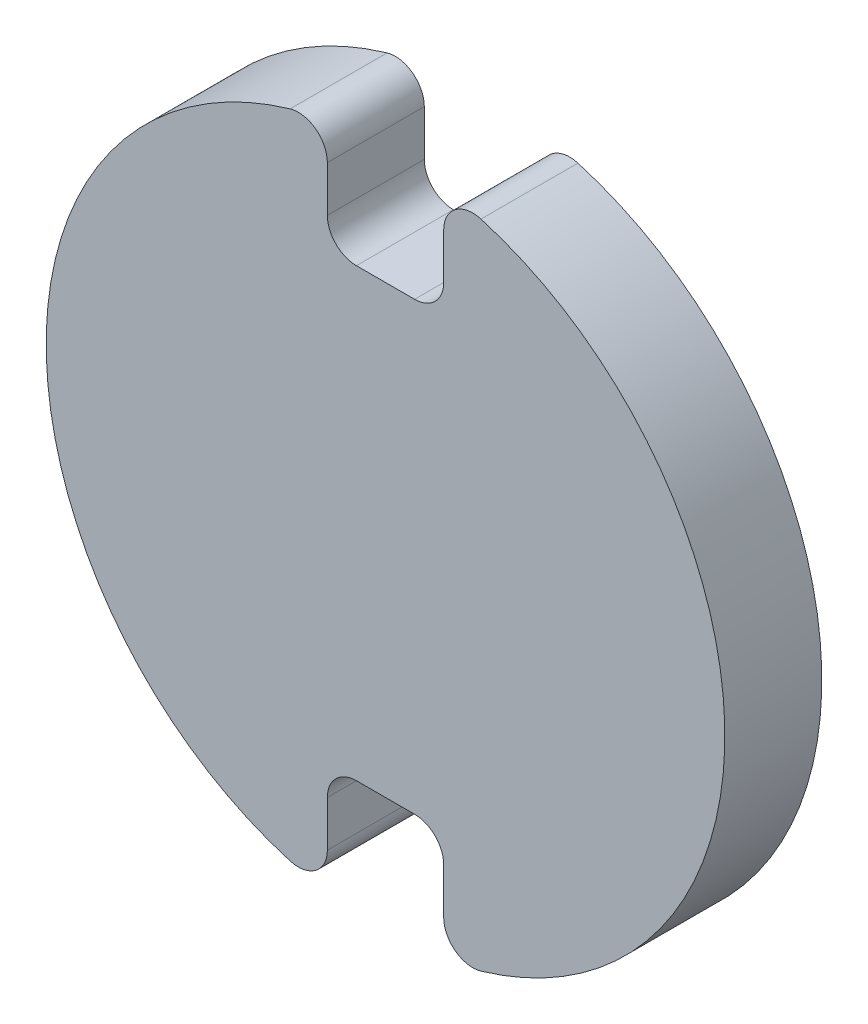
ISO-10303-21;
HEADER;
FILE_DESCRIPTION(('STEP AP214'),'2;1');
FILE_NAME('part.step','',(''),(''),'','','');
FILE_SCHEMA(('AUTOMOTIVE_DESIGN { 1 0 10303 214 1 1 1 1 }'));
ENDSEC;
DATA;
#1=APPLICATION_CONTEXT('core data for automotive mechanical design processes');
#2=APPLICATION_PROTOCOL_DEFINITION('international standard','automotive_design',2000,#1);
#3=PRODUCT_CONTEXT('',#1,'mechanical');
#4=PRODUCT('Part','Part','',(#3));
#5=PRODUCT_RELATED_PRODUCT_CATEGORY('part','',(#4));
#6=PRODUCT_DEFINITION_FORMATION('','',#4);
#7=PRODUCT_DEFINITION_CONTEXT('part definition',#1,'design');
#8=PRODUCT_DEFINITION('design','',#6,#7);
#9=PRODUCT_DEFINITION_SHAPE('','',#8);
#10=(LENGTH_UNIT() NAMED_UNIT(*) SI_UNIT(.MILLI.,.METRE.));
#11=(NAMED_UNIT(*) PLANE_ANGLE_UNIT() SI_UNIT($,.RADIAN.));
#12=(NAMED_UNIT(*) SI_UNIT($,.STERADIAN.) SOLID_ANGLE_UNIT());
#13=UNCERTAINTY_MEASURE_WITH_UNIT(LENGTH_MEASURE(1.E-05),#10,'distance_accuracy_value','');
#14=(GEOMETRIC_REPRESENTATION_CONTEXT(3) GLOBAL_UNCERTAINTY_ASSIGNED_CONTEXT((#13)) GLOBAL_UNIT_ASSIGNED_CONTEXT((#10,
#11,#12)) REPRESENTATION_CONTEXT('',''));
#15=CARTESIAN_POINT('',(0.,0.,0.));
#16=DIRECTION('',(0.,0.,1.));
#17=DIRECTION('',(1.,0.,0.));
#18=AXIS2_PLACEMENT_3D('',#15,#16,#17);
#19=CARTESIAN_POINT('',(0.,0.,10.));
#20=DIRECTION('',(0.,0.,-1.));
#21=DIRECTION('',(-1.,0.,0.));
#22=AXIS2_PLACEMENT_3D('',#19,#20,#21);
#23=CYLINDRICAL_SURFACE('',#22,35.);
#24=CARTESIAN_POINT('',(0.,0.,10.));
#25=DIRECTION('',(0.,0.,1.));
#26=DIRECTION('',(1.,0.,0.));
#27=AXIS2_PLACEMENT_3D('',#24,#25,#26);
#28=CIRCLE('',#27,35.);
#29=CARTESIAN_POINT('',(9.84374999999999,-33.5872086654652,10.));
#30=VERTEX_POINT('',#29);
#31=CARTESIAN_POINT('',(9.84375,33.5872086654652,10.));
#32=VERTEX_POINT('',#31);
#33=EDGE_CURVE('E172',#30,#32,#28,.T.);
#34=ORIENTED_EDGE('',*,*,#33,.F.);
#35=DIRECTION('',(0.,0.,-1.));
#36=VECTOR('',#35,1.);
#37=CARTESIAN_POINT('',(9.84374999999999,-33.5872086654652,10.));
#38=LINE('',#37,#36);
#39=CARTESIAN_POINT('',(9.84374999999999,-33.5872086654652,0.));
#40=VERTEX_POINT('',#39);
#41=EDGE_CURVE('E211',#30,#40,#38,.T.);
#42=ORIENTED_EDGE('',*,*,#41,.T.);
#43=CARTESIAN_POINT('',(0.,0.,0.));
#44=DIRECTION('',(0.,0.,1.));
#45=DIRECTION('',(1.,0.,0.));
#46=AXIS2_PLACEMENT_3D('',#43,#44,#45);
#47=CIRCLE('',#46,35.);
#48=CARTESIAN_POINT('',(9.84375,33.5872086654652,0.));
#49=VERTEX_POINT('',#48);
#50=EDGE_CURVE('E262',#40,#49,#47,.T.);
#51=ORIENTED_EDGE('',*,*,#50,.T.);
#52=DIRECTION('',(0.,0.,-1.));
#53=VECTOR('',#52,1.);
#54=CARTESIAN_POINT('',(9.84375,33.5872086654652,10.));
#55=LINE('',#54,#53);
#56=EDGE_CURVE('E208',#49,#32,#55,.F.);
#57=ORIENTED_EDGE('',*,*,#56,.T.);
#58=EDGE_LOOP('',(#34,#42,#51,#57));
#59=FACE_BOUND('',#58,.T.);
#60=ADVANCED_FACE('F36',(#59),#23,.T.);
#61=CARTESIAN_POINT('',(-9.84375,33.5872086654652,0.));
#62=VERTEX_POINT('',#61);
#63=CARTESIAN_POINT('',(-9.84375,-33.5872086654652,0.));
#64=VERTEX_POINT('',#63);
#65=EDGE_CURVE('E269',#62,#64,#47,.T.);
#66=ORIENTED_EDGE('',*,*,#65,.T.);
#67=DIRECTION('',(0.,0.,-1.));
#68=VECTOR('',#67,1.);
#69=CARTESIAN_POINT('',(-9.84375000000001,-33.5872086654652,10.));
#70=LINE('',#69,#68);
#71=CARTESIAN_POINT('',(-9.84375,-33.5872086654652,10.));
#72=VERTEX_POINT('',#71);
#73=EDGE_CURVE('E161',#64,#72,#70,.F.);
#74=ORIENTED_EDGE('',*,*,#73,.T.);
#75=CARTESIAN_POINT('',(-9.84375,33.5872086654652,10.));
#76=VERTEX_POINT('',#75);
#77=EDGE_CURVE('E154',#76,#72,#28,.T.);
#78=ORIENTED_EDGE('',*,*,#77,.F.);
#79=DIRECTION('',(0.,0.,-1.));
#80=VECTOR('',#79,1.);
#81=CARTESIAN_POINT('',(-9.84375000000001,33.5872086654652,10.));
#82=LINE('',#81,#80);
#83=EDGE_CURVE('E168',#76,#62,#82,.T.);
#84=ORIENTED_EDGE('',*,*,#83,.T.);
#85=EDGE_LOOP('',(#66,#74,#78,#84));
#86=FACE_BOUND('',#85,.T.);
#87=ADVANCED_FACE('F167',(#86),#23,.T.);
#88=CARTESIAN_POINT('',(0.,0.,10.));
#89=DIRECTION('',(0.,0.,1.));
#90=DIRECTION('',(1.,0.,0.));
#91=AXIS2_PLACEMENT_3D('',#88,#89,#90);
#92=PLANE('',#91);
#93=ORIENTED_EDGE('',*,*,#77,.T.);
#94=CARTESIAN_POINT('',(-9.,-30.7083050655682,10.));
#95=DIRECTION('',(0.,0.,1.));
#96=DIRECTION('',(1.,0.,0.));
#97=AXIS2_PLACEMENT_3D('',#94,#95,#96);
#98=CIRCLE('',#97,3.);
#99=CARTESIAN_POINT('',(-6.,-30.7083050655682,10.));
#100=VERTEX_POINT('',#99);
#101=EDGE_CURVE('E186',#72,#100,#98,.T.);
#102=ORIENTED_EDGE('',*,*,#101,.T.);
#103=DIRECTION('',(0.,-1.,0.));
#104=VECTOR('',#103,1.);
#105=CARTESIAN_POINT('',(-6.,0.,10.));
#106=LINE('',#105,#104);
#107=CARTESIAN_POINT('',(-6.,-26.,10.));
#108=VERTEX_POINT('',#107);
#109=EDGE_CURVE('E264',#108,#100,#106,.T.);
#110=ORIENTED_EDGE('',*,*,#109,.F.);
#111=CARTESIAN_POINT('',(-3.,-26.,10.));
#112=DIRECTION('',(0.,0.,1.));
#113=DIRECTION('',(1.,0.,0.));
#114=AXIS2_PLACEMENT_3D('',#111,#112,#113);
#115=CIRCLE('',#114,3.);
#116=CARTESIAN_POINT('',(-3.,-23.,10.));
#117=VERTEX_POINT('',#116);
#118=EDGE_CURVE('E229',#108,#117,#115,.F.);
#119=ORIENTED_EDGE('',*,*,#118,.T.);
#120=DIRECTION('',(-1.,0.,0.));
#121=VECTOR('',#120,1.);
#122=CARTESIAN_POINT('',(0.,-23.,10.));
#123=LINE('',#122,#121);
#124=CARTESIAN_POINT('',(3.,-23.,10.));
#125=VERTEX_POINT('',#124);
#126=EDGE_CURVE('E283',#125,#117,#123,.T.);
#127=ORIENTED_EDGE('',*,*,#126,.F.);
#128=CARTESIAN_POINT('',(2.99999999999999,-26.,10.));
#129=DIRECTION('',(0.,0.,1.));
#130=DIRECTION('',(1.,0.,0.));
#131=AXIS2_PLACEMENT_3D('',#128,#129,#130);
#132=CIRCLE('',#131,3.);
#133=CARTESIAN_POINT('',(5.99999999999999,-26.,10.));
#134=VERTEX_POINT('',#133);
#135=EDGE_CURVE('E232',#125,#134,#132,.F.);
#136=ORIENTED_EDGE('',*,*,#135,.T.);
#137=DIRECTION('',(0.,1.,0.));
#138=VECTOR('',#137,1.);
#139=CARTESIAN_POINT('',(6.00000000000002,0.,10.));
#140=LINE('',#139,#138);
#141=CARTESIAN_POINT('',(5.99999999999999,-30.7083050655682,10.));
#142=VERTEX_POINT('',#141);
#143=EDGE_CURVE('E281',#142,#134,#140,.T.);
#144=ORIENTED_EDGE('',*,*,#143,.F.);
#145=CARTESIAN_POINT('',(8.99999999999999,-30.7083050655682,10.));
#146=DIRECTION('',(0.,0.,1.));
#147=DIRECTION('',(1.,0.,0.));
#148=AXIS2_PLACEMENT_3D('',#145,#146,#147);
#149=CIRCLE('',#148,3.);
#150=EDGE_CURVE('E184',#142,#30,#149,.T.);
#151=ORIENTED_EDGE('',*,*,#150,.T.);
#152=ORIENTED_EDGE('',*,*,#33,.T.);
#153=CARTESIAN_POINT('',(9.,30.7083050655682,10.));
#154=DIRECTION('',(0.,0.,1.));
#155=DIRECTION('',(1.,0.,0.));
#156=AXIS2_PLACEMENT_3D('',#153,#154,#155);
#157=CIRCLE('',#156,3.);
#158=CARTESIAN_POINT('',(6.,30.7083050655682,10.));
#159=VERTEX_POINT('',#158);
#160=EDGE_CURVE('E160',#32,#159,#157,.T.);
#161=ORIENTED_EDGE('',*,*,#160,.T.);
#162=DIRECTION('',(0.,1.,0.));
#163=VECTOR('',#162,1.);
#164=CARTESIAN_POINT('',(5.99999999999999,0.,10.));
#165=LINE('',#164,#163);
#166=CARTESIAN_POINT('',(6.,26.,10.));
#167=VERTEX_POINT('',#166);
#168=EDGE_CURVE('E257',#167,#159,#165,.T.);
#169=ORIENTED_EDGE('',*,*,#168,.F.);
#170=CARTESIAN_POINT('',(3.,26.,10.));
#171=DIRECTION('',(0.,0.,1.));
#172=DIRECTION('',(1.,0.,0.));
#173=AXIS2_PLACEMENT_3D('',#170,#171,#172);
#174=CIRCLE('',#173,3.);
#175=CARTESIAN_POINT('',(3.,23.,10.));
#176=VERTEX_POINT('',#175);
#177=EDGE_CURVE('E11',#167,#176,#174,.F.);
#178=ORIENTED_EDGE('',*,*,#177,.T.);
#179=DIRECTION('',(1.,0.,0.));
#180=VECTOR('',#179,1.);
#181=CARTESIAN_POINT('',(0.,23.,10.));
#182=LINE('',#181,#180);
#183=CARTESIAN_POINT('',(-3.,23.,10.));
#184=VERTEX_POINT('',#183);
#185=EDGE_CURVE('E255',#184,#176,#182,.T.);
#186=ORIENTED_EDGE('',*,*,#185,.F.);
#187=CARTESIAN_POINT('',(-3.,26.,10.));
#188=DIRECTION('',(0.,0.,1.));
#189=DIRECTION('',(1.,0.,0.));
#190=AXIS2_PLACEMENT_3D('',#187,#188,#189);
#191=CIRCLE('',#190,3.);
#192=CARTESIAN_POINT('',(-6.,26.,10.));
#193=VERTEX_POINT('',#192);
#194=EDGE_CURVE('E236',#184,#193,#191,.F.);
#195=ORIENTED_EDGE('',*,*,#194,.T.);
#196=DIRECTION('',(0.,-1.,0.));
#197=VECTOR('',#196,1.);
#198=CARTESIAN_POINT('',(-6.00000000000001,0.,10.));
#199=LINE('',#198,#197);
#200=CARTESIAN_POINT('',(-6.,30.7083050655682,10.));
#201=VERTEX_POINT('',#200);
#202=EDGE_CURVE('E156',#201,#193,#199,.T.);
#203=ORIENTED_EDGE('',*,*,#202,.F.);
#204=CARTESIAN_POINT('',(-9.,30.7083050655682,10.));
#205=DIRECTION('',(0.,0.,1.));
#206=DIRECTION('',(1.,0.,0.));
#207=AXIS2_PLACEMENT_3D('',#204,#205,#206);
#208=CIRCLE('',#207,3.);
#209=EDGE_CURVE('E151',#201,#76,#208,.T.);
#210=ORIENTED_EDGE('',*,*,#209,.T.);
#211=EDGE_LOOP('',(#93,#102,#110,#119,#127,#136,#144,#151,#152,#161,#169,#178,#186,#195,#203,#210));
#212=FACE_BOUND('',#211,.T.);
#213=ADVANCED_FACE('F153',(#212),#92,.T.);
#214=CARTESIAN_POINT('',(0.,0.,0.));
#215=DIRECTION('',(0.,0.,1.));
#216=DIRECTION('',(1.,0.,0.));
#217=AXIS2_PLACEMENT_3D('',#214,#215,#216);
#218=PLANE('',#217);
#219=DIRECTION('',(0.,-1.,0.));
#220=VECTOR('',#219,1.);
#221=CARTESIAN_POINT('',(-6.,0.,0.));
#222=LINE('',#221,#220);
#223=CARTESIAN_POINT('',(-6.,-26.,0.));
#224=VERTEX_POINT('',#223);
#225=CARTESIAN_POINT('',(-6.,-30.7083050655682,0.));
#226=VERTEX_POINT('',#225);
#227=EDGE_CURVE('E171',#224,#226,#222,.T.);
#228=ORIENTED_EDGE('',*,*,#227,.T.);
#229=CARTESIAN_POINT('',(-9.,-30.7083050655682,0.));
#230=DIRECTION('',(0.,0.,1.));
#231=DIRECTION('',(1.,0.,0.));
#232=AXIS2_PLACEMENT_3D('',#229,#230,#231);
#233=CIRCLE('',#232,3.);
#234=EDGE_CURVE('E197',#226,#64,#233,.F.);
#235=ORIENTED_EDGE('',*,*,#234,.T.);
#236=ORIENTED_EDGE('',*,*,#65,.F.);
#237=CARTESIAN_POINT('',(-9.,30.7083050655682,0.));
#238=DIRECTION('',(0.,0.,1.));
#239=DIRECTION('',(1.,0.,0.));
#240=AXIS2_PLACEMENT_3D('',#237,#238,#239);
#241=CIRCLE('',#240,3.);
#242=CARTESIAN_POINT('',(-6.,30.7083050655682,0.));
#243=VERTEX_POINT('',#242);
#244=EDGE_CURVE('E175',#62,#243,#241,.F.);
#245=ORIENTED_EDGE('',*,*,#244,.T.);
#246=DIRECTION('',(0.,1.,0.));
#247=VECTOR('',#246,1.);
#248=CARTESIAN_POINT('',(-6.,35.,0.));
#249=LINE('',#248,#247);
#250=CARTESIAN_POINT('',(-6.,26.,0.));
#251=VERTEX_POINT('',#250);
#252=EDGE_CURVE('E291',#251,#243,#249,.T.);
#253=ORIENTED_EDGE('',*,*,#252,.F.);
#254=CARTESIAN_POINT('',(-3.,26.,0.));
#255=DIRECTION('',(0.,0.,1.));
#256=DIRECTION('',(1.,0.,0.));
#257=AXIS2_PLACEMENT_3D('',#254,#255,#256);
#258=CIRCLE('',#257,3.);
#259=CARTESIAN_POINT('',(-3.,23.,0.));
#260=VERTEX_POINT('',#259);
#261=EDGE_CURVE('E234',#251,#260,#258,.T.);
#262=ORIENTED_EDGE('',*,*,#261,.T.);
#263=DIRECTION('',(-1.,0.,0.));
#264=VECTOR('',#263,1.);
#265=CARTESIAN_POINT('',(6.,23.,0.));
#266=LINE('',#265,#264);
#267=CARTESIAN_POINT('',(3.,23.,0.));
#268=VERTEX_POINT('',#267);
#269=EDGE_CURVE('E243',#268,#260,#266,.T.);
#270=ORIENTED_EDGE('',*,*,#269,.F.);
#271=CARTESIAN_POINT('',(3.,26.,0.));
#272=DIRECTION('',(0.,0.,1.));
#273=DIRECTION('',(1.,0.,0.));
#274=AXIS2_PLACEMENT_3D('',#271,#272,#273);
#275=CIRCLE('',#274,3.);
#276=CARTESIAN_POINT('',(6.,26.,0.));
#277=VERTEX_POINT('',#276);
#278=EDGE_CURVE('E44',#268,#277,#275,.T.);
#279=ORIENTED_EDGE('',*,*,#278,.T.);
#280=DIRECTION('',(0.,1.,0.));
#281=VECTOR('',#280,1.);
#282=CARTESIAN_POINT('',(5.99999999999999,0.,0.));
#283=LINE('',#282,#281);
#284=CARTESIAN_POINT('',(6.,30.7083050655682,0.));
#285=VERTEX_POINT('',#284);
#286=EDGE_CURVE('E176',#277,#285,#283,.T.);
#287=ORIENTED_EDGE('',*,*,#286,.T.);
#288=CARTESIAN_POINT('',(9.,30.7083050655682,0.));
#289=DIRECTION('',(0.,0.,1.));
#290=DIRECTION('',(1.,0.,0.));
#291=AXIS2_PLACEMENT_3D('',#288,#289,#290);
#292=CIRCLE('',#291,3.);
#293=EDGE_CURVE('E193',#285,#49,#292,.F.);
#294=ORIENTED_EDGE('',*,*,#293,.T.);
#295=ORIENTED_EDGE('',*,*,#50,.F.);
#296=CARTESIAN_POINT('',(8.99999999999999,-30.7083050655682,0.));
#297=DIRECTION('',(0.,0.,1.));
#298=DIRECTION('',(1.,0.,0.));
#299=AXIS2_PLACEMENT_3D('',#296,#297,#298);
#300=CIRCLE('',#299,3.);
#301=CARTESIAN_POINT('',(5.99999999999999,-30.7083050655682,0.));
#302=VERTEX_POINT('',#301);
#303=EDGE_CURVE('E195',#40,#302,#300,.F.);
#304=ORIENTED_EDGE('',*,*,#303,.T.);
#305=DIRECTION('',(0.,-1.,0.));
#306=VECTOR('',#305,1.);
#307=CARTESIAN_POINT('',(6.,-23.,0.));
#308=LINE('',#307,#306);
#309=CARTESIAN_POINT('',(5.99999999999999,-26.,0.));
#310=VERTEX_POINT('',#309);
#311=EDGE_CURVE('E288',#310,#302,#308,.T.);
#312=ORIENTED_EDGE('',*,*,#311,.F.);
#313=CARTESIAN_POINT('',(2.99999999999999,-26.,0.));
#314=DIRECTION('',(0.,0.,1.));
#315=DIRECTION('',(1.,0.,0.));
#316=AXIS2_PLACEMENT_3D('',#313,#314,#315);
#317=CIRCLE('',#316,3.);
#318=CARTESIAN_POINT('',(3.,-23.,0.));
#319=VERTEX_POINT('',#318);
#320=EDGE_CURVE('E51',#310,#319,#317,.T.);
#321=ORIENTED_EDGE('',*,*,#320,.T.);
#322=DIRECTION('',(1.,0.,0.));
#323=VECTOR('',#322,1.);
#324=CARTESIAN_POINT('',(6.,-23.,0.));
#325=LINE('',#324,#323);
#326=CARTESIAN_POINT('',(-3.,-23.,0.));
#327=VERTEX_POINT('',#326);
#328=EDGE_CURVE('E292',#327,#319,#325,.T.);
#329=ORIENTED_EDGE('',*,*,#328,.F.);
#330=CARTESIAN_POINT('',(-3.,-26.,0.));
#331=DIRECTION('',(0.,0.,1.));
#332=DIRECTION('',(1.,0.,0.));
#333=AXIS2_PLACEMENT_3D('',#330,#331,#332);
#334=CIRCLE('',#333,3.);
#335=EDGE_CURVE('E59',#327,#224,#334,.T.);
#336=ORIENTED_EDGE('',*,*,#335,.T.);
#337=EDGE_LOOP('',(#228,#235,#236,#245,#253,#262,#270,#279,#287,#294,#295,#304,#312,#321,#329,#336));
#338=FACE_BOUND('',#337,.T.);
#339=ADVANCED_FACE('F240',(#338),#218,.F.);
#340=CARTESIAN_POINT('',(-6.,-23.,16.));
#341=DIRECTION('',(-1.,0.,0.));
#342=DIRECTION('',(0.,-1.,0.));
#343=AXIS2_PLACEMENT_3D('',#340,#341,#342);
#344=PLANE('',#343);
#345=ORIENTED_EDGE('',*,*,#109,.T.);
#346=DIRECTION('',(0.,0.,-1.));
#347=VECTOR('',#346,1.);
#348=CARTESIAN_POINT('',(-6.,-30.7083050655682,16.));
#349=LINE('',#348,#347);
#350=EDGE_CURVE('E190',#100,#226,#349,.T.);
#351=ORIENTED_EDGE('',*,*,#350,.T.);
#352=ORIENTED_EDGE('',*,*,#227,.F.);
#353=DIRECTION('',(0.,0.,-1.));
#354=VECTOR('',#353,1.);
#355=CARTESIAN_POINT('',(-6.,-26.,10.));
#356=LINE('',#355,#354);
#357=EDGE_CURVE('E188',#224,#108,#356,.F.);
#358=ORIENTED_EDGE('',*,*,#357,.T.);
#359=EDGE_LOOP('',(#345,#351,#352,#358));
#360=FACE_BOUND('',#359,.T.);
#361=ADVANCED_FACE('F280',(#360),#344,.F.);
#362=CARTESIAN_POINT('',(6.,-23.,16.));
#363=DIRECTION('',(1.,0.,0.));
#364=DIRECTION('',(0.,1.,0.));
#365=AXIS2_PLACEMENT_3D('',#362,#363,#364);
#366=PLANE('',#365);
#367=ORIENTED_EDGE('',*,*,#143,.T.);
#368=DIRECTION('',(0.,0.,-1.));
#369=VECTOR('',#368,1.);
#370=CARTESIAN_POINT('',(5.99999999999999,-26.,0.));
#371=LINE('',#370,#369);
#372=EDGE_CURVE('E205',#134,#310,#371,.T.);
#373=ORIENTED_EDGE('',*,*,#372,.T.);
#374=ORIENTED_EDGE('',*,*,#311,.T.);
#375=DIRECTION('',(0.,0.,-1.));
#376=VECTOR('',#375,1.);
#377=CARTESIAN_POINT('',(5.99999999999999,-30.7083050655682,16.));
#378=LINE('',#377,#376);
#379=EDGE_CURVE('E203',#302,#142,#378,.F.);
#380=ORIENTED_EDGE('',*,*,#379,.T.);
#381=EDGE_LOOP('',(#367,#373,#374,#380));
#382=FACE_BOUND('',#381,.T.);
#383=ADVANCED_FACE('F342',(#382),#366,.F.);
#384=CARTESIAN_POINT('',(6.,-23.,16.));
#385=DIRECTION('',(0.,1.,0.));
#386=DIRECTION('',(-1.,0.,0.));
#387=AXIS2_PLACEMENT_3D('',#384,#385,#386);
#388=PLANE('',#387);
#389=ORIENTED_EDGE('',*,*,#126,.T.);
#390=DIRECTION('',(0.,0.,-1.));
#391=VECTOR('',#390,1.);
#392=CARTESIAN_POINT('',(-3.,-23.,0.));
#393=LINE('',#392,#391);
#394=EDGE_CURVE('E201',#117,#327,#393,.T.);
#395=ORIENTED_EDGE('',*,*,#394,.T.);
#396=ORIENTED_EDGE('',*,*,#328,.T.);
#397=DIRECTION('',(0.,0.,-1.));
#398=VECTOR('',#397,1.);
#399=CARTESIAN_POINT('',(3.,-23.,10.));
#400=LINE('',#399,#398);
#401=EDGE_CURVE('E199',#319,#125,#400,.F.);
#402=ORIENTED_EDGE('',*,*,#401,.T.);
#403=EDGE_LOOP('',(#389,#395,#396,#402));
#404=FACE_BOUND('',#403,.T.);
#405=ADVANCED_FACE('F349',(#404),#388,.F.);
#406=CARTESIAN_POINT('',(-6.,35.,16.));
#407=DIRECTION('',(-1.,0.,0.));
#408=DIRECTION('',(0.,-1.,0.));
#409=AXIS2_PLACEMENT_3D('',#406,#407,#408);
#410=PLANE('',#409);
#411=ORIENTED_EDGE('',*,*,#252,.T.);
#412=DIRECTION('',(0.,0.,-1.));
#413=VECTOR('',#412,1.);
#414=CARTESIAN_POINT('',(-6.,30.7083050655682,16.));
#415=LINE('',#414,#413);
#416=EDGE_CURVE('E221',#243,#201,#415,.F.);
#417=ORIENTED_EDGE('',*,*,#416,.T.);
#418=ORIENTED_EDGE('',*,*,#202,.T.);
#419=DIRECTION('',(0.,0.,-1.));
#420=VECTOR('',#419,1.);
#421=CARTESIAN_POINT('',(-6.,26.,0.));
#422=LINE('',#421,#420);
#423=EDGE_CURVE('E218',#193,#251,#422,.T.);
#424=ORIENTED_EDGE('',*,*,#423,.T.);
#425=EDGE_LOOP('',(#411,#417,#418,#424));
#426=FACE_BOUND('',#425,.T.);
#427=ADVANCED_FACE('F298',(#426),#410,.F.);
#428=CARTESIAN_POINT('',(6.,35.,16.));
#429=DIRECTION('',(1.,0.,0.));
#430=DIRECTION('',(0.,1.,0.));
#431=AXIS2_PLACEMENT_3D('',#428,#429,#430);
#432=PLANE('',#431);
#433=ORIENTED_EDGE('',*,*,#168,.T.);
#434=DIRECTION('',(0.,0.,-1.));
#435=VECTOR('',#434,1.);
#436=CARTESIAN_POINT('',(6.,30.7083050655682,16.));
#437=LINE('',#436,#435);
#438=EDGE_CURVE('E216',#159,#285,#437,.T.);
#439=ORIENTED_EDGE('',*,*,#438,.T.);
#440=ORIENTED_EDGE('',*,*,#286,.F.);
#441=DIRECTION('',(0.,0.,-1.));
#442=VECTOR('',#441,1.);
#443=CARTESIAN_POINT('',(6.,26.,10.));
#444=LINE('',#443,#442);
#445=EDGE_CURVE('E214',#277,#167,#444,.F.);
#446=ORIENTED_EDGE('',*,*,#445,.T.);
#447=EDGE_LOOP('',(#433,#439,#440,#446));
#448=FACE_BOUND('',#447,.T.);
#449=ADVANCED_FACE('F249',(#448),#432,.F.);
#450=CARTESIAN_POINT('',(6.,23.,16.));
#451=DIRECTION('',(0.,-1.,0.));
#452=DIRECTION('',(0.,0.,-1.));
#453=AXIS2_PLACEMENT_3D('',#450,#451,#452);
#454=PLANE('',#453);
#455=ORIENTED_EDGE('',*,*,#269,.T.);
#456=DIRECTION('',(0.,0.,-1.));
#457=VECTOR('',#456,1.);
#458=CARTESIAN_POINT('',(-3.,23.,10.));
#459=LINE('',#458,#457);
#460=EDGE_CURVE('E226',#260,#184,#459,.F.);
#461=ORIENTED_EDGE('',*,*,#460,.T.);
#462=ORIENTED_EDGE('',*,*,#185,.T.);
#463=DIRECTION('',(0.,0.,-1.));
#464=VECTOR('',#463,1.);
#465=CARTESIAN_POINT('',(3.,23.,0.));
#466=LINE('',#465,#464);
#467=EDGE_CURVE('E223',#176,#268,#466,.T.);
#468=ORIENTED_EDGE('',*,*,#467,.T.);
#469=EDGE_LOOP('',(#455,#461,#462,#468));
#470=FACE_BOUND('',#469,.T.);
#471=ADVANCED_FACE('F259',(#470),#454,.F.);
#472=CARTESIAN_POINT('',(-9.,-30.7083050655682,10.));
#473=DIRECTION('',(0.,0.,-1.));
#474=DIRECTION('',(-1.,0.,0.));
#475=AXIS2_PLACEMENT_3D('',#472,#473,#474);
#476=CYLINDRICAL_SURFACE('',#475,3.);
#477=ORIENTED_EDGE('',*,*,#234,.F.);
#478=ORIENTED_EDGE('',*,*,#350,.F.);
#479=ORIENTED_EDGE('',*,*,#101,.F.);
#480=ORIENTED_EDGE('',*,*,#73,.F.);
#481=EDGE_LOOP('',(#477,#478,#479,#480));
#482=FACE_BOUND('',#481,.T.);
#483=ADVANCED_FACE('F276',(#482),#476,.T.);
#484=CARTESIAN_POINT('',(-3.,-26.,16.));
#485=DIRECTION('',(0.,0.,1.));
#486=DIRECTION('',(1.,0.,0.));
#487=AXIS2_PLACEMENT_3D('',#484,#485,#486);
#488=CYLINDRICAL_SURFACE('',#487,3.);
#489=ORIENTED_EDGE('',*,*,#118,.F.);
#490=ORIENTED_EDGE('',*,*,#357,.F.);
#491=ORIENTED_EDGE('',*,*,#335,.F.);
#492=ORIENTED_EDGE('',*,*,#394,.F.);
#493=EDGE_LOOP('',(#489,#490,#491,#492));
#494=FACE_BOUND('',#493,.T.);
#495=ADVANCED_FACE('F321',(#494),#488,.F.);
#496=CARTESIAN_POINT('',(2.99999999999999,-26.,16.));
#497=DIRECTION('',(0.,0.,1.));
#498=DIRECTION('',(1.,0.,0.));
#499=AXIS2_PLACEMENT_3D('',#496,#497,#498);
#500=CYLINDRICAL_SURFACE('',#499,3.);
#501=ORIENTED_EDGE('',*,*,#135,.F.);
#502=ORIENTED_EDGE('',*,*,#401,.F.);
#503=ORIENTED_EDGE('',*,*,#320,.F.);
#504=ORIENTED_EDGE('',*,*,#372,.F.);
#505=EDGE_LOOP('',(#501,#502,#503,#504));
#506=FACE_BOUND('',#505,.T.);
#507=ADVANCED_FACE('F324',(#506),#500,.F.);
#508=CARTESIAN_POINT('',(8.99999999999999,-30.7083050655682,10.));
#509=DIRECTION('',(0.,0.,-1.));
#510=DIRECTION('',(-1.,0.,0.));
#511=AXIS2_PLACEMENT_3D('',#508,#509,#510);
#512=CYLINDRICAL_SURFACE('',#511,3.);
#513=ORIENTED_EDGE('',*,*,#150,.F.);
#514=ORIENTED_EDGE('',*,*,#379,.F.);
#515=ORIENTED_EDGE('',*,*,#303,.F.);
#516=ORIENTED_EDGE('',*,*,#41,.F.);
#517=EDGE_LOOP('',(#513,#514,#515,#516));
#518=FACE_BOUND('',#517,.T.);
#519=ADVANCED_FACE('F327',(#518),#512,.T.);
#520=CARTESIAN_POINT('',(9.,30.7083050655682,10.));
#521=DIRECTION('',(0.,0.,-1.));
#522=DIRECTION('',(-1.,0.,0.));
#523=AXIS2_PLACEMENT_3D('',#520,#521,#522);
#524=CYLINDRICAL_SURFACE('',#523,3.);
#525=ORIENTED_EDGE('',*,*,#293,.F.);
#526=ORIENTED_EDGE('',*,*,#438,.F.);
#527=ORIENTED_EDGE('',*,*,#160,.F.);
#528=ORIENTED_EDGE('',*,*,#56,.F.);
#529=EDGE_LOOP('',(#525,#526,#527,#528));
#530=FACE_BOUND('',#529,.T.);
#531=ADVANCED_FACE('F307',(#530),#524,.T.);
#532=CARTESIAN_POINT('',(-9.,30.7083050655682,10.));
#533=DIRECTION('',(0.,0.,-1.));
#534=DIRECTION('',(-1.,0.,0.));
#535=AXIS2_PLACEMENT_3D('',#532,#533,#534);
#536=CYLINDRICAL_SURFACE('',#535,3.);
#537=ORIENTED_EDGE('',*,*,#209,.F.);
#538=ORIENTED_EDGE('',*,*,#416,.F.);
#539=ORIENTED_EDGE('',*,*,#244,.F.);
#540=ORIENTED_EDGE('',*,*,#83,.F.);
#541=EDGE_LOOP('',(#537,#538,#539,#540));
#542=FACE_BOUND('',#541,.T.);
#543=ADVANCED_FACE('F174',(#542),#536,.T.);
#544=CARTESIAN_POINT('',(-3.,26.,16.));
#545=DIRECTION('',(0.,0.,1.));
#546=DIRECTION('',(1.,0.,0.));
#547=AXIS2_PLACEMENT_3D('',#544,#545,#546);
#548=CYLINDRICAL_SURFACE('',#547,3.);
#549=ORIENTED_EDGE('',*,*,#194,.F.);
#550=ORIENTED_EDGE('',*,*,#460,.F.);
#551=ORIENTED_EDGE('',*,*,#261,.F.);
#552=ORIENTED_EDGE('',*,*,#423,.F.);
#553=EDGE_LOOP('',(#549,#550,#551,#552));
#554=FACE_BOUND('',#553,.T.);
#555=ADVANCED_FACE('F301',(#554),#548,.F.);
#556=CARTESIAN_POINT('',(3.,26.,16.));
#557=DIRECTION('',(0.,0.,1.));
#558=DIRECTION('',(1.,0.,0.));
#559=AXIS2_PLACEMENT_3D('',#556,#557,#558);
#560=CYLINDRICAL_SURFACE('',#559,3.);
#561=ORIENTED_EDGE('',*,*,#177,.F.);
#562=ORIENTED_EDGE('',*,*,#445,.F.);
#563=ORIENTED_EDGE('',*,*,#278,.F.);
#564=ORIENTED_EDGE('',*,*,#467,.F.);
#565=EDGE_LOOP('',(#561,#562,#563,#564));
#566=FACE_BOUND('',#565,.T.);
#567=ADVANCED_FACE('F38',(#566),#560,.F.);
#568=CLOSED_SHELL('',(#60,#87,#213,#339,#361,#383,#405,#427,#449,#471,#483,#495,#507,#519,#531,
#543,#555,#567));
#569=MANIFOLD_SOLID_BREP('B2',#568);
#570=ADVANCED_BREP_SHAPE_REPRESENTATION('',(#18,#569),#14);
#571=SHAPE_DEFINITION_REPRESENTATION(#9,#570);
ENDSEC;
END-ISO-10303-21;
